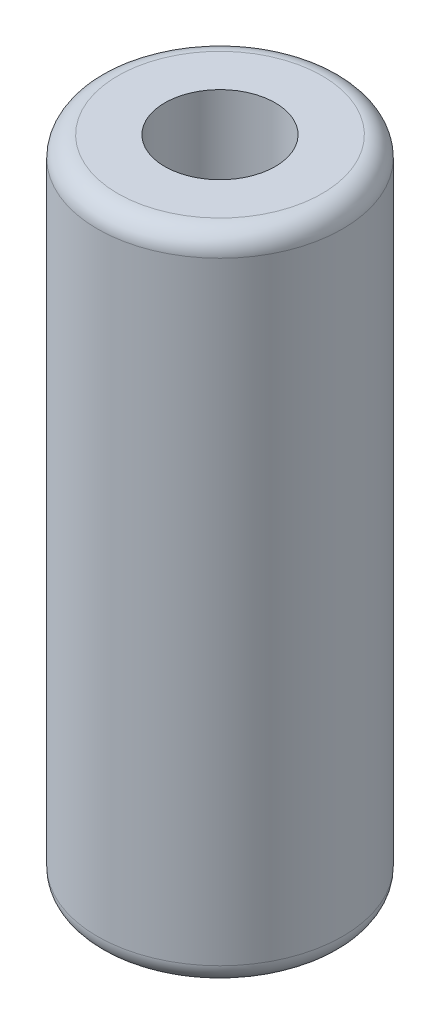
ISO-10303-21;
HEADER;
FILE_DESCRIPTION(('STEP AP214'),'2;1');
FILE_NAME('part.step','',(''),(''),'','','');
FILE_SCHEMA(('AUTOMOTIVE_DESIGN { 1 0 10303 214 1 1 1 1 }'));
ENDSEC;
DATA;
#1=APPLICATION_CONTEXT('core data for automotive mechanical design processes');
#2=APPLICATION_PROTOCOL_DEFINITION('international standard','automotive_design',2000,#1);
#3=PRODUCT_CONTEXT('',#1,'mechanical');
#4=PRODUCT('Part','Part','',(#3));
#5=PRODUCT_RELATED_PRODUCT_CATEGORY('part','',(#4));
#6=PRODUCT_DEFINITION_FORMATION('','',#4);
#7=PRODUCT_DEFINITION_CONTEXT('part definition',#1,'design');
#8=PRODUCT_DEFINITION('design','',#6,#7);
#9=PRODUCT_DEFINITION_SHAPE('','',#8);
#10=(LENGTH_UNIT() NAMED_UNIT(*) SI_UNIT(.MILLI.,.METRE.));
#11=(NAMED_UNIT(*) PLANE_ANGLE_UNIT() SI_UNIT($,.RADIAN.));
#12=(NAMED_UNIT(*) SI_UNIT($,.STERADIAN.) SOLID_ANGLE_UNIT());
#13=UNCERTAINTY_MEASURE_WITH_UNIT(LENGTH_MEASURE(1.E-05),#10,'distance_accuracy_value','');
#14=(GEOMETRIC_REPRESENTATION_CONTEXT(3) GLOBAL_UNCERTAINTY_ASSIGNED_CONTEXT((#13)) GLOBAL_UNIT_ASSIGNED_CONTEXT((#10,
#11,#12)) REPRESENTATION_CONTEXT('',''));
#15=CARTESIAN_POINT('',(0.,0.,0.));
#16=DIRECTION('',(0.,0.,1.));
#17=DIRECTION('',(1.,0.,0.));
#18=AXIS2_PLACEMENT_3D('',#15,#16,#17);
#19=CARTESIAN_POINT('',(0.,-8.,0.));
#20=DIRECTION('',(0.,1.,0.));
#21=DIRECTION('',(0.,0.,1.));
#22=AXIS2_PLACEMENT_3D('',#19,#20,#21);
#23=CYLINDRICAL_SURFACE('',#22,3.);
#24=CARTESIAN_POINT('',(0.,-7.5,0.));
#25=DIRECTION('',(0.,1.,0.));
#26=DIRECTION('',(0.,0.,1.));
#27=AXIS2_PLACEMENT_3D('',#24,#25,#26);
#28=CIRCLE('',#27,3.);
#29=CARTESIAN_POINT('',(0.,-7.5,3.));
#30=VERTEX_POINT('',#29);
#31=EDGE_CURVE('E73',#30,#30,#28,.T.);
#32=ORIENTED_EDGE('',*,*,#31,.T.);
#33=EDGE_LOOP('',(#32));
#34=FACE_BOUND('',#33,.T.);
#35=CARTESIAN_POINT('',(0.,7.5,0.));
#36=DIRECTION('',(0.,1.,0.));
#37=DIRECTION('',(0.,0.,1.));
#38=AXIS2_PLACEMENT_3D('',#35,#36,#37);
#39=CIRCLE('',#38,3.);
#40=CARTESIAN_POINT('',(0.,7.5,3.));
#41=VERTEX_POINT('',#40);
#42=EDGE_CURVE('E70',#41,#41,#39,.F.);
#43=ORIENTED_EDGE('',*,*,#42,.T.);
#44=EDGE_LOOP('',(#43));
#45=FACE_BOUND('',#44,.T.);
#46=ADVANCED_FACE('F35',(#34,#45),#23,.T.);
#47=CARTESIAN_POINT('',(0.,-8.,0.));
#48=DIRECTION('',(0.,1.,0.));
#49=DIRECTION('',(0.,0.,1.));
#50=AXIS2_PLACEMENT_3D('',#47,#48,#49);
#51=PLANE('',#50);
#52=CARTESIAN_POINT('',(0.,-8.,0.));
#53=DIRECTION('',(0.,1.,0.));
#54=DIRECTION('',(0.,0.,1.));
#55=AXIS2_PLACEMENT_3D('',#52,#53,#54);
#56=CIRCLE('',#55,2.5);
#57=CARTESIAN_POINT('',(0.,-8.,2.5));
#58=VERTEX_POINT('',#57);
#59=EDGE_CURVE('E43',#58,#58,#56,.F.);
#60=ORIENTED_EDGE('',*,*,#59,.T.);
#61=EDGE_LOOP('',(#60));
#62=FACE_BOUND('',#61,.T.);
#63=CARTESIAN_POINT('',(0.,-8.,0.));
#64=DIRECTION('',(0.,-1.,0.));
#65=DIRECTION('',(0.,0.,-1.));
#66=AXIS2_PLACEMENT_3D('',#63,#64,#65);
#67=CIRCLE('',#66,1.35254999999999);
#68=CARTESIAN_POINT('',(0.,-8.,-1.35254999999999));
#69=VERTEX_POINT('',#68);
#70=EDGE_CURVE('E60',#69,#69,#67,.T.);
#71=ORIENTED_EDGE('',*,*,#70,.F.);
#72=EDGE_LOOP('',(#71));
#73=FACE_BOUND('',#72,.T.);
#74=ADVANCED_FACE('F78',(#62,#73),#51,.F.);
#75=CARTESIAN_POINT('',(0.,8.,0.));
#76=DIRECTION('',(0.,1.,0.));
#77=DIRECTION('',(0.,0.,1.));
#78=AXIS2_PLACEMENT_3D('',#75,#76,#77);
#79=PLANE('',#78);
#80=CARTESIAN_POINT('',(0.,8.,0.));
#81=DIRECTION('',(0.,1.,0.));
#82=DIRECTION('',(0.,0.,1.));
#83=AXIS2_PLACEMENT_3D('',#80,#81,#82);
#84=CIRCLE('',#83,2.5);
#85=CARTESIAN_POINT('',(0.,8.,2.5));
#86=VERTEX_POINT('',#85);
#87=EDGE_CURVE('E11',#86,#86,#84,.T.);
#88=ORIENTED_EDGE('',*,*,#87,.T.);
#89=EDGE_LOOP('',(#88));
#90=FACE_BOUND('',#89,.T.);
#91=CARTESIAN_POINT('',(0.,8.,0.));
#92=DIRECTION('',(0.,1.,0.));
#93=DIRECTION('',(0.,0.,1.));
#94=AXIS2_PLACEMENT_3D('',#91,#92,#93);
#95=CIRCLE('',#94,1.35255);
#96=CARTESIAN_POINT('',(0.,8.,1.35255));
#97=VERTEX_POINT('',#96);
#98=EDGE_CURVE('E59',#97,#97,#95,.T.);
#99=ORIENTED_EDGE('',*,*,#98,.F.);
#100=EDGE_LOOP('',(#99));
#101=FACE_BOUND('',#100,.T.);
#102=ADVANCED_FACE('F95',(#90,#101),#79,.T.);
#103=CARTESIAN_POINT('',(0.,1.,0.));
#104=DIRECTION('',(0.,1.,0.));
#105=DIRECTION('',(0.,0.,1.));
#106=AXIS2_PLACEMENT_3D('',#103,#104,#105);
#107=CONICAL_SURFACE('',#106,1.35255,1.02974425867665);
#108=CARTESIAN_POINT('',(0.,0.187305969734274,0.));
#109=VERTEX_POINT('',#108);
#110=VERTEX_LOOP('',#109);
#111=FACE_BOUND('',#110,.T.);
#112=CARTESIAN_POINT('',(0.,1.,0.));
#113=DIRECTION('',(0.,1.,0.));
#114=DIRECTION('',(0.,0.,1.));
#115=AXIS2_PLACEMENT_3D('',#112,#113,#114);
#116=CIRCLE('',#115,1.35255);
#117=CARTESIAN_POINT('',(0.,1.,1.35255));
#118=VERTEX_POINT('',#117);
#119=EDGE_CURVE('E63',#118,#118,#116,.T.);
#120=ORIENTED_EDGE('',*,*,#119,.T.);
#121=EDGE_LOOP('',(#120));
#122=FACE_BOUND('',#121,.T.);
#123=ADVANCED_FACE('F98',(#111,#122),#107,.F.);
#124=CARTESIAN_POINT('',(0.,8.,0.));
#125=DIRECTION('',(0.,1.,0.));
#126=DIRECTION('',(0.,0.,1.));
#127=AXIS2_PLACEMENT_3D('',#124,#125,#126);
#128=CYLINDRICAL_SURFACE('',#127,1.35255);
#129=ORIENTED_EDGE('',*,*,#119,.F.);
#130=EDGE_LOOP('',(#129));
#131=FACE_BOUND('',#130,.T.);
#132=ORIENTED_EDGE('',*,*,#98,.T.);
#133=EDGE_LOOP('',(#132));
#134=FACE_BOUND('',#133,.T.);
#135=ADVANCED_FACE('F53',(#131,#134),#128,.F.);
#136=CARTESIAN_POINT('',(0.,-1.,0.));
#137=DIRECTION('',(0.,-1.,0.));
#138=DIRECTION('',(0.,0.,-1.));
#139=AXIS2_PLACEMENT_3D('',#136,#137,#138);
#140=CONICAL_SURFACE('',#139,1.35255,1.02974425867665);
#141=CARTESIAN_POINT('',(0.,-0.187305969734272,0.));
#142=VERTEX_POINT('',#141);
#143=VERTEX_LOOP('',#142);
#144=FACE_BOUND('',#143,.T.);
#145=CARTESIAN_POINT('',(0.,-1.,0.));
#146=DIRECTION('',(0.,-1.,0.));
#147=DIRECTION('',(0.,0.,-1.));
#148=AXIS2_PLACEMENT_3D('',#145,#146,#147);
#149=CIRCLE('',#148,1.35255);
#150=CARTESIAN_POINT('',(0.,-1.,-1.35255));
#151=VERTEX_POINT('',#150);
#152=EDGE_CURVE('E57',#151,#151,#149,.T.);
#153=ORIENTED_EDGE('',*,*,#152,.T.);
#154=EDGE_LOOP('',(#153));
#155=FACE_BOUND('',#154,.T.);
#156=ADVANCED_FACE('F49',(#144,#155),#140,.F.);
#157=CARTESIAN_POINT('',(0.,-8.,0.));
#158=DIRECTION('',(0.,-1.,0.));
#159=DIRECTION('',(0.,0.,-1.));
#160=AXIS2_PLACEMENT_3D('',#157,#158,#159);
#161=CYLINDRICAL_SURFACE('',#160,1.35254999999999);
#162=ORIENTED_EDGE('',*,*,#152,.F.);
#163=EDGE_LOOP('',(#162));
#164=FACE_BOUND('',#163,.T.);
#165=ORIENTED_EDGE('',*,*,#70,.T.);
#166=EDGE_LOOP('',(#165));
#167=FACE_BOUND('',#166,.T.);
#168=ADVANCED_FACE('F52',(#164,#167),#161,.F.);
#169=CARTESIAN_POINT('',(0.,-7.5,0.));
#170=DIRECTION('',(0.,1.,0.));
#171=DIRECTION('',(0.,0.,1.));
#172=AXIS2_PLACEMENT_3D('',#169,#170,#171);
#173=TOROIDAL_SURFACE('',#172,2.5,0.5);
#174=ORIENTED_EDGE('',*,*,#59,.F.);
#175=EDGE_LOOP('',(#174));
#176=FACE_BOUND('',#175,.T.);
#177=ORIENTED_EDGE('',*,*,#31,.F.);
#178=EDGE_LOOP('',(#177));
#179=FACE_BOUND('',#178,.T.);
#180=ADVANCED_FACE('F81',(#176,#179),#173,.T.);
#181=CARTESIAN_POINT('',(0.,7.5,0.));
#182=DIRECTION('',(0.,1.,0.));
#183=DIRECTION('',(0.,0.,1.));
#184=AXIS2_PLACEMENT_3D('',#181,#182,#183);
#185=TOROIDAL_SURFACE('',#184,2.5,0.5);
#186=ORIENTED_EDGE('',*,*,#42,.F.);
#187=EDGE_LOOP('',(#186));
#188=FACE_BOUND('',#187,.T.);
#189=ORIENTED_EDGE('',*,*,#87,.F.);
#190=EDGE_LOOP('',(#189));
#191=FACE_BOUND('',#190,.T.);
#192=ADVANCED_FACE('F37',(#188,#191),#185,.T.);
#193=CLOSED_SHELL('',(#46,#74,#102,#123,#135,#156,#168,#180,#192));
#194=MANIFOLD_SOLID_BREP('B2',#193);
#195=ADVANCED_BREP_SHAPE_REPRESENTATION('',(#18,#194),#14);
#196=SHAPE_DEFINITION_REPRESENTATION(#9,#195);
ENDSEC;
END-ISO-10303-21;
